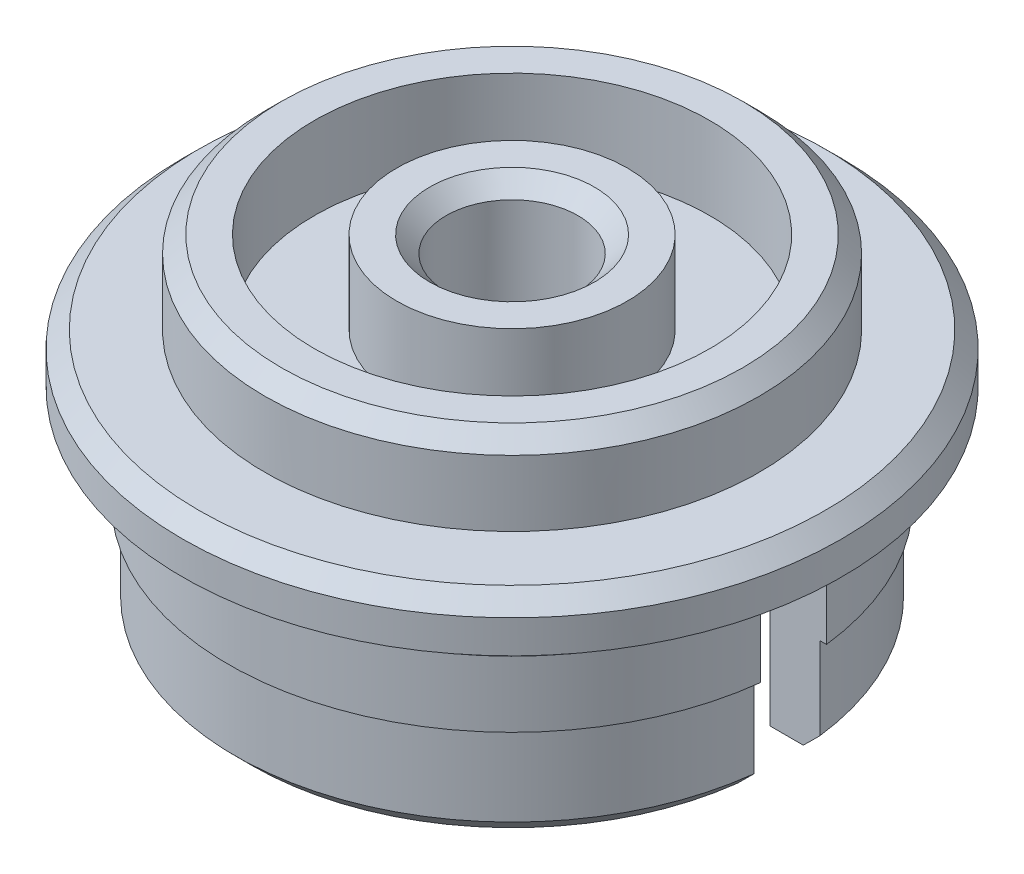
ISO-10303-21;
HEADER;
FILE_DESCRIPTION(('STEP AP214'),'2;1');
FILE_NAME('part.step','',(''),(''),'','','');
FILE_SCHEMA(('AUTOMOTIVE_DESIGN { 1 0 10303 214 1 1 1 1 }'));
ENDSEC;
DATA;
#1=APPLICATION_CONTEXT('core data for automotive mechanical design processes');
#2=APPLICATION_PROTOCOL_DEFINITION('international standard','automotive_design',2000,#1);
#3=PRODUCT_CONTEXT('',#1,'mechanical');
#4=PRODUCT('Part','Part','',(#3));
#5=PRODUCT_RELATED_PRODUCT_CATEGORY('part','',(#4));
#6=PRODUCT_DEFINITION_FORMATION('','',#4);
#7=PRODUCT_DEFINITION_CONTEXT('part definition',#1,'design');
#8=PRODUCT_DEFINITION('design','',#6,#7);
#9=PRODUCT_DEFINITION_SHAPE('','',#8);
#10=(LENGTH_UNIT() NAMED_UNIT(*) SI_UNIT(.MILLI.,.METRE.));
#11=(NAMED_UNIT(*) PLANE_ANGLE_UNIT() SI_UNIT($,.RADIAN.));
#12=(NAMED_UNIT(*) SI_UNIT($,.STERADIAN.) SOLID_ANGLE_UNIT());
#13=UNCERTAINTY_MEASURE_WITH_UNIT(LENGTH_MEASURE(1.E-05),#10,'distance_accuracy_value','');
#14=(GEOMETRIC_REPRESENTATION_CONTEXT(3) GLOBAL_UNCERTAINTY_ASSIGNED_CONTEXT((#13)) GLOBAL_UNIT_ASSIGNED_CONTEXT((#10,
#11,#12)) REPRESENTATION_CONTEXT('',''));
#15=CARTESIAN_POINT('',(0.,0.,0.));
#16=DIRECTION('',(0.,0.,1.));
#17=DIRECTION('',(1.,0.,0.));
#18=AXIS2_PLACEMENT_3D('',#15,#16,#17);
#19=CARTESIAN_POINT('',(0.,-10.,0.));
#20=DIRECTION('',(0.,-1.,0.));
#21=DIRECTION('',(0.,0.,-1.));
#22=AXIS2_PLACEMENT_3D('',#19,#20,#21);
#23=CYLINDRICAL_SURFACE('',#22,8.4);
#24=DIRECTION('',(0.,-1.,0.));
#25=VECTOR('',#24,1.);
#26=CARTESIAN_POINT('',(8.34026378479722,-10.,-1.));
#27=LINE('',#26,#25);
#28=CARTESIAN_POINT('',(8.34026378479722,-5.,-1.));
#29=VERTEX_POINT('',#28);
#30=CARTESIAN_POINT('',(8.34026378479722,-4.,-1.));
#31=VERTEX_POINT('',#30);
#32=EDGE_CURVE('E342',#29,#31,#27,.F.);
#33=ORIENTED_EDGE('',*,*,#32,.F.);
#34=CARTESIAN_POINT('',(0.,-5.,0.));
#35=DIRECTION('',(0.,-1.,0.));
#36=DIRECTION('',(0.,0.,-1.));
#37=AXIS2_PLACEMENT_3D('',#34,#35,#36);
#38=CIRCLE('',#37,8.4);
#39=CARTESIAN_POINT('',(-8.34026378479722,-5.,-1.));
#40=VERTEX_POINT('',#39);
#41=EDGE_CURVE('E223',#40,#29,#38,.T.);
#42=ORIENTED_EDGE('',*,*,#41,.F.);
#43=DIRECTION('',(0.,-1.,0.));
#44=VECTOR('',#43,1.);
#45=CARTESIAN_POINT('',(-8.34026378479722,-10.,-1.));
#46=LINE('',#45,#44);
#47=CARTESIAN_POINT('',(-8.34026378479722,-4.,-1.));
#48=VERTEX_POINT('',#47);
#49=EDGE_CURVE('E358',#48,#40,#46,.T.);
#50=ORIENTED_EDGE('',*,*,#49,.F.);
#51=CARTESIAN_POINT('',(0.,-4.,0.));
#52=DIRECTION('',(0.,-1.,0.));
#53=DIRECTION('',(0.,0.,-1.));
#54=AXIS2_PLACEMENT_3D('',#51,#52,#53);
#55=CIRCLE('',#54,8.4);
#56=EDGE_CURVE('E227',#48,#31,#55,.T.);
#57=ORIENTED_EDGE('',*,*,#56,.T.);
#58=EDGE_LOOP('',(#33,#42,#50,#57));
#59=FACE_BOUND('',#58,.T.);
#60=ADVANCED_FACE('F34',(#59),#23,.T.);
#61=CARTESIAN_POINT('',(8.4,-5.,0.));
#62=DIRECTION('',(0.,1.,0.));
#63=DIRECTION('',(0.,0.,1.));
#64=AXIS2_PLACEMENT_3D('',#61,#62,#63);
#65=PLANE('',#64);
#66=DIRECTION('',(-1.,0.,0.));
#67=VECTOR('',#66,1.);
#68=CARTESIAN_POINT('',(8.4,-5.,-1.));
#69=LINE('',#68,#67);
#70=CARTESIAN_POINT('',(8.54166260162505,-5.,-1.));
#71=VERTEX_POINT('',#70);
#72=EDGE_CURVE('E340',#71,#29,#69,.T.);
#73=ORIENTED_EDGE('',*,*,#72,.F.);
#74=CARTESIAN_POINT('',(0.,-5.,0.));
#75=DIRECTION('',(0.,-1.,0.));
#76=DIRECTION('',(0.,0.,-1.));
#77=AXIS2_PLACEMENT_3D('',#74,#75,#76);
#78=CIRCLE('',#77,8.6);
#79=CARTESIAN_POINT('',(-8.54166260162505,-5.,-1.));
#80=VERTEX_POINT('',#79);
#81=EDGE_CURVE('E219',#80,#71,#78,.T.);
#82=ORIENTED_EDGE('',*,*,#81,.F.);
#83=DIRECTION('',(-1.,0.,0.));
#84=VECTOR('',#83,1.);
#85=CARTESIAN_POINT('',(8.4,-5.,-1.));
#86=LINE('',#85,#84);
#87=EDGE_CURVE('E356',#40,#80,#86,.T.);
#88=ORIENTED_EDGE('',*,*,#87,.F.);
#89=ORIENTED_EDGE('',*,*,#41,.T.);
#90=EDGE_LOOP('',(#73,#82,#88,#89));
#91=FACE_BOUND('',#90,.T.);
#92=ADVANCED_FACE('F405',(#91),#65,.T.);
#93=CARTESIAN_POINT('',(0.,-10.,0.));
#94=DIRECTION('',(0.,-1.,0.));
#95=DIRECTION('',(0.,0.,-1.));
#96=AXIS2_PLACEMENT_3D('',#93,#94,#95);
#97=CYLINDRICAL_SURFACE('',#96,8.6);
#98=DIRECTION('',(0.,-1.,0.));
#99=VECTOR('',#98,1.);
#100=CARTESIAN_POINT('',(8.54166260162505,-10.,-1.));
#101=LINE('',#100,#99);
#102=CARTESIAN_POINT('',(8.54166260162505,-7.,-1.));
#103=VERTEX_POINT('',#102);
#104=EDGE_CURVE('E338',#103,#71,#101,.F.);
#105=ORIENTED_EDGE('',*,*,#104,.F.);
#106=CARTESIAN_POINT('',(0.,-7.,0.));
#107=DIRECTION('',(0.,-1.,0.));
#108=DIRECTION('',(0.,0.,-1.));
#109=AXIS2_PLACEMENT_3D('',#106,#107,#108);
#110=CIRCLE('',#109,8.6);
#111=CARTESIAN_POINT('',(-8.54166260162505,-7.,-1.));
#112=VERTEX_POINT('',#111);
#113=EDGE_CURVE('E215',#112,#103,#110,.T.);
#114=ORIENTED_EDGE('',*,*,#113,.F.);
#115=DIRECTION('',(0.,-1.,0.));
#116=VECTOR('',#115,1.);
#117=CARTESIAN_POINT('',(-8.54166260162505,-10.,-1.));
#118=LINE('',#117,#116);
#119=EDGE_CURVE('E354',#80,#112,#118,.T.);
#120=ORIENTED_EDGE('',*,*,#119,.F.);
#121=ORIENTED_EDGE('',*,*,#81,.T.);
#122=EDGE_LOOP('',(#105,#114,#120,#121));
#123=FACE_BOUND('',#122,.T.);
#124=ADVANCED_FACE('F412',(#123),#97,.T.);
#125=CARTESIAN_POINT('',(8.6,-7.,0.));
#126=DIRECTION('',(0.,-1.,0.));
#127=DIRECTION('',(0.,0.,-1.));
#128=AXIS2_PLACEMENT_3D('',#125,#126,#127);
#129=PLANE('',#128);
#130=DIRECTION('',(1.,0.,0.));
#131=VECTOR('',#130,1.);
#132=CARTESIAN_POINT('',(8.6,-7.,-1.));
#133=LINE('',#132,#131);
#134=CARTESIAN_POINT('',(8.34026378479722,-7.,-1.));
#135=VERTEX_POINT('',#134);
#136=EDGE_CURVE('E336',#135,#103,#133,.T.);
#137=ORIENTED_EDGE('',*,*,#136,.F.);
#138=CARTESIAN_POINT('',(0.,-7.,0.));
#139=DIRECTION('',(0.,-1.,0.));
#140=DIRECTION('',(0.,0.,-1.));
#141=AXIS2_PLACEMENT_3D('',#138,#139,#140);
#142=CIRCLE('',#141,8.4);
#143=CARTESIAN_POINT('',(-8.34026378479722,-7.,-1.));
#144=VERTEX_POINT('',#143);
#145=EDGE_CURVE('E211',#144,#135,#142,.T.);
#146=ORIENTED_EDGE('',*,*,#145,.F.);
#147=DIRECTION('',(1.,0.,0.));
#148=VECTOR('',#147,1.);
#149=CARTESIAN_POINT('',(8.6,-7.,-1.));
#150=LINE('',#149,#148);
#151=EDGE_CURVE('E309',#112,#144,#150,.T.);
#152=ORIENTED_EDGE('',*,*,#151,.F.);
#153=ORIENTED_EDGE('',*,*,#113,.T.);
#154=EDGE_LOOP('',(#137,#146,#152,#153));
#155=FACE_BOUND('',#154,.T.);
#156=ADVANCED_FACE('F537',(#155),#129,.T.);
#157=CARTESIAN_POINT('',(0.,-10.,0.));
#158=DIRECTION('',(0.,-1.,0.));
#159=DIRECTION('',(0.,0.,-1.));
#160=AXIS2_PLACEMENT_3D('',#157,#158,#159);
#161=CYLINDRICAL_SURFACE('',#160,8.4);
#162=DIRECTION('',(0.,-1.,0.));
#163=VECTOR('',#162,1.);
#164=CARTESIAN_POINT('',(8.34026378479722,-10.,-1.));
#165=LINE('',#164,#163);
#166=CARTESIAN_POINT('',(8.34026378479722,-9.50000000000001,-1.));
#167=VERTEX_POINT('',#166);
#168=EDGE_CURVE('E306',#167,#135,#165,.F.);
#169=ORIENTED_EDGE('',*,*,#168,.F.);
#170=CARTESIAN_POINT('',(0.,-9.50000000000001,0.));
#171=DIRECTION('',(0.,-1.,0.));
#172=DIRECTION('',(0.,0.,-1.));
#173=AXIS2_PLACEMENT_3D('',#170,#171,#172);
#174=CIRCLE('',#173,8.4);
#175=CARTESIAN_POINT('',(-8.34026378479722,-9.50000000000001,-1.));
#176=VERTEX_POINT('',#175);
#177=EDGE_CURVE('E264',#167,#176,#174,.F.);
#178=ORIENTED_EDGE('',*,*,#177,.T.);
#179=DIRECTION('',(0.,-1.,0.));
#180=VECTOR('',#179,1.);
#181=CARTESIAN_POINT('',(-8.34026378479722,-10.,-1.));
#182=LINE('',#181,#180);
#183=EDGE_CURVE('E304',#144,#176,#182,.T.);
#184=ORIENTED_EDGE('',*,*,#183,.F.);
#185=ORIENTED_EDGE('',*,*,#145,.T.);
#186=EDGE_LOOP('',(#169,#178,#184,#185));
#187=FACE_BOUND('',#186,.T.);
#188=ADVANCED_FACE('F303',(#187),#161,.T.);
#189=CARTESIAN_POINT('',(8.4,-10.,0.));
#190=DIRECTION('',(0.,-1.,0.));
#191=DIRECTION('',(0.,0.,-1.));
#192=AXIS2_PLACEMENT_3D('',#189,#190,#191);
#193=PLANE('',#192);
#194=DIRECTION('',(1.,0.,0.));
#195=VECTOR('',#194,1.);
#196=CARTESIAN_POINT('',(-8.94427190999916,-10.,-1.));
#197=LINE('',#196,#195);
#198=CARTESIAN_POINT('',(-7.83645327938603,-10.,-1.));
#199=VERTEX_POINT('',#198);
#200=CARTESIAN_POINT('',(-6.82715167547931,-10.,-1.));
#201=VERTEX_POINT('',#200);
#202=EDGE_CURVE('E318',#199,#201,#197,.T.);
#203=ORIENTED_EDGE('',*,*,#202,.F.);
#204=CARTESIAN_POINT('',(0.,-10.,0.));
#205=DIRECTION('',(0.,-1.,0.));
#206=DIRECTION('',(0.,0.,-1.));
#207=AXIS2_PLACEMENT_3D('',#204,#205,#206);
#208=CIRCLE('',#207,7.9);
#209=CARTESIAN_POINT('',(7.83645327938603,-10.,-1.));
#210=VERTEX_POINT('',#209);
#211=EDGE_CURVE('E255',#199,#210,#208,.T.);
#212=ORIENTED_EDGE('',*,*,#211,.T.);
#213=DIRECTION('',(1.,0.,0.));
#214=VECTOR('',#213,1.);
#215=CARTESIAN_POINT('',(5.91607978309962,-10.,-1.));
#216=LINE('',#215,#214);
#217=CARTESIAN_POINT('',(6.82715167547931,-10.,-1.));
#218=VERTEX_POINT('',#217);
#219=EDGE_CURVE('E173',#218,#210,#216,.T.);
#220=ORIENTED_EDGE('',*,*,#219,.F.);
#221=CARTESIAN_POINT('',(0.,-10.,0.));
#222=DIRECTION('',(0.,-1.,0.));
#223=DIRECTION('',(0.,0.,-1.));
#224=AXIS2_PLACEMENT_3D('',#221,#222,#223);
#225=CIRCLE('',#224,6.9);
#226=EDGE_CURVE('E187',#201,#218,#225,.T.);
#227=ORIENTED_EDGE('',*,*,#226,.F.);
#228=EDGE_LOOP('',(#203,#212,#220,#227));
#229=FACE_BOUND('',#228,.T.);
#230=ADVANCED_FACE('F316',(#229),#193,.T.);
#231=CARTESIAN_POINT('',(0.,-4.,0.));
#232=DIRECTION('',(0.,-1.,0.));
#233=DIRECTION('',(0.,0.,-1.));
#234=AXIS2_PLACEMENT_3D('',#231,#232,#233);
#235=CYLINDRICAL_SURFACE('',#234,6.9);
#236=ORIENTED_EDGE('',*,*,#226,.T.);
#237=DIRECTION('',(0.,-1.,0.));
#238=VECTOR('',#237,1.);
#239=CARTESIAN_POINT('',(6.82715167547931,-4.,-1.));
#240=LINE('',#239,#238);
#241=CARTESIAN_POINT('',(6.82715167547931,-4.,-1.));
#242=VERTEX_POINT('',#241);
#243=EDGE_CURVE('E181',#218,#242,#240,.F.);
#244=ORIENTED_EDGE('',*,*,#243,.T.);
#245=CARTESIAN_POINT('',(0.,-4.,0.));
#246=DIRECTION('',(0.,-1.,0.));
#247=DIRECTION('',(0.,0.,-1.));
#248=AXIS2_PLACEMENT_3D('',#245,#246,#247);
#249=CIRCLE('',#248,6.9);
#250=CARTESIAN_POINT('',(-6.82715167547931,-4.,-1.));
#251=VERTEX_POINT('',#250);
#252=EDGE_CURVE('E196',#251,#242,#249,.T.);
#253=ORIENTED_EDGE('',*,*,#252,.F.);
#254=DIRECTION('',(0.,-1.,0.));
#255=VECTOR('',#254,1.);
#256=CARTESIAN_POINT('',(-6.82715167547931,-4.,-1.));
#257=LINE('',#256,#255);
#258=EDGE_CURVE('E310',#251,#201,#257,.T.);
#259=ORIENTED_EDGE('',*,*,#258,.T.);
#260=EDGE_LOOP('',(#236,#244,#253,#259));
#261=FACE_BOUND('',#260,.T.);
#262=ADVANCED_FACE('F402',(#261),#235,.F.);
#263=CARTESIAN_POINT('',(0.,0.,0.));
#264=DIRECTION('',(0.,1.,0.));
#265=DIRECTION('',(0.,0.,1.));
#266=AXIS2_PLACEMENT_3D('',#263,#264,#265);
#267=PLANE('',#266);
#268=CARTESIAN_POINT('',(0.,0.,0.));
#269=DIRECTION('',(0.,1.,0.));
#270=DIRECTION('',(0.,0.,1.));
#271=AXIS2_PLACEMENT_3D('',#268,#269,#270);
#272=CIRCLE('',#271,7.);
#273=CARTESIAN_POINT('',(0.,0.,7.));
#274=VERTEX_POINT('',#273);
#275=EDGE_CURVE('E246',#274,#274,#272,.T.);
#276=ORIENTED_EDGE('',*,*,#275,.T.);
#277=EDGE_LOOP('',(#276));
#278=FACE_BOUND('',#277,.T.);
#279=CARTESIAN_POINT('',(0.,0.,0.));
#280=DIRECTION('',(0.,1.,0.));
#281=DIRECTION('',(0.,0.,1.));
#282=AXIS2_PLACEMENT_3D('',#279,#280,#281);
#283=CIRCLE('',#282,6.);
#284=CARTESIAN_POINT('',(0.,0.,6.));
#285=VERTEX_POINT('',#284);
#286=EDGE_CURVE('E201',#285,#285,#283,.T.);
#287=ORIENTED_EDGE('',*,*,#286,.F.);
#288=EDGE_LOOP('',(#287));
#289=FACE_BOUND('',#288,.T.);
#290=ADVANCED_FACE('F472',(#278,#289),#267,.T.);
#291=CARTESIAN_POINT('',(0.,-10.,0.));
#292=DIRECTION('',(0.,-1.,0.));
#293=DIRECTION('',(0.,0.,-1.));
#294=AXIS2_PLACEMENT_3D('',#291,#292,#293);
#295=CYLINDRICAL_SURFACE('',#294,7.5);
#296=CARTESIAN_POINT('',(0.,-0.500000000000002,0.));
#297=DIRECTION('',(0.,1.,0.));
#298=DIRECTION('',(0.,0.,1.));
#299=AXIS2_PLACEMENT_3D('',#296,#297,#298);
#300=CIRCLE('',#299,7.5);
#301=CARTESIAN_POINT('',(0.,-0.500000000000002,7.5));
#302=VERTEX_POINT('',#301);
#303=EDGE_CURVE('E243',#302,#302,#300,.F.);
#304=ORIENTED_EDGE('',*,*,#303,.T.);
#305=EDGE_LOOP('',(#304));
#306=FACE_BOUND('',#305,.T.);
#307=CARTESIAN_POINT('',(0.,-2.5,0.));
#308=DIRECTION('',(0.,-1.,0.));
#309=DIRECTION('',(0.,0.,-1.));
#310=AXIS2_PLACEMENT_3D('',#307,#308,#309);
#311=CIRCLE('',#310,7.5);
#312=CARTESIAN_POINT('',(0.,-2.5,-7.5));
#313=VERTEX_POINT('',#312);
#314=EDGE_CURVE('E182',#313,#313,#311,.T.);
#315=ORIENTED_EDGE('',*,*,#314,.F.);
#316=EDGE_LOOP('',(#315));
#317=FACE_BOUND('',#316,.T.);
#318=ADVANCED_FACE('F475',(#306,#317),#295,.T.);
#319=CARTESIAN_POINT('',(7.5,-2.5,0.));
#320=DIRECTION('',(0.,1.,0.));
#321=DIRECTION('',(0.,0.,1.));
#322=AXIS2_PLACEMENT_3D('',#319,#320,#321);
#323=PLANE('',#322);
#324=CARTESIAN_POINT('',(0.,-2.5,0.));
#325=DIRECTION('',(0.,1.,0.));
#326=DIRECTION('',(0.,0.,1.));
#327=AXIS2_PLACEMENT_3D('',#324,#325,#326);
#328=CIRCLE('',#327,9.5);
#329=CARTESIAN_POINT('',(0.,-2.5,9.5));
#330=VERTEX_POINT('',#329);
#331=EDGE_CURVE('E252',#330,#330,#328,.T.);
#332=ORIENTED_EDGE('',*,*,#331,.T.);
#333=EDGE_LOOP('',(#332));
#334=FACE_BOUND('',#333,.T.);
#335=ORIENTED_EDGE('',*,*,#314,.T.);
#336=EDGE_LOOP('',(#335));
#337=FACE_BOUND('',#336,.T.);
#338=ADVANCED_FACE('F479',(#334,#337),#323,.T.);
#339=CARTESIAN_POINT('',(0.,-10.,0.));
#340=DIRECTION('',(0.,-1.,0.));
#341=DIRECTION('',(0.,0.,-1.));
#342=AXIS2_PLACEMENT_3D('',#339,#340,#341);
#343=CYLINDRICAL_SURFACE('',#342,10.);
#344=CARTESIAN_POINT('',(0.,-3.,0.));
#345=DIRECTION('',(0.,1.,0.));
#346=DIRECTION('',(0.,0.,1.));
#347=AXIS2_PLACEMENT_3D('',#344,#345,#346);
#348=CIRCLE('',#347,10.);
#349=CARTESIAN_POINT('',(0.,-3.,10.));
#350=VERTEX_POINT('',#349);
#351=EDGE_CURVE('E249',#350,#350,#348,.F.);
#352=ORIENTED_EDGE('',*,*,#351,.T.);
#353=EDGE_LOOP('',(#352));
#354=FACE_BOUND('',#353,.T.);
#355=CARTESIAN_POINT('',(0.,-4.,0.));
#356=DIRECTION('',(0.,-1.,0.));
#357=DIRECTION('',(0.,0.,-1.));
#358=AXIS2_PLACEMENT_3D('',#355,#356,#357);
#359=CIRCLE('',#358,10.);
#360=CARTESIAN_POINT('',(0.,-4.,-10.));
#361=VERTEX_POINT('',#360);
#362=EDGE_CURVE('E230',#361,#361,#359,.T.);
#363=ORIENTED_EDGE('',*,*,#362,.F.);
#364=EDGE_LOOP('',(#363));
#365=FACE_BOUND('',#364,.T.);
#366=ADVANCED_FACE('F427',(#354,#365),#343,.T.);
#367=CARTESIAN_POINT('',(10.,-4.,0.));
#368=DIRECTION('',(0.,-1.,0.));
#369=DIRECTION('',(0.,0.,-1.));
#370=AXIS2_PLACEMENT_3D('',#367,#368,#369);
#371=PLANE('',#370);
#372=ORIENTED_EDGE('',*,*,#252,.T.);
#373=DIRECTION('',(1.,0.,0.));
#374=VECTOR('',#373,1.);
#375=CARTESIAN_POINT('',(5.91607978309962,-4.,-1.));
#376=LINE('',#375,#374);
#377=EDGE_CURVE('E321',#242,#31,#376,.T.);
#378=ORIENTED_EDGE('',*,*,#377,.T.);
#379=ORIENTED_EDGE('',*,*,#56,.F.);
#380=DIRECTION('',(1.,0.,0.));
#381=VECTOR('',#380,1.);
#382=CARTESIAN_POINT('',(-8.94427190999916,-4.,-1.));
#383=LINE('',#382,#381);
#384=EDGE_CURVE('E344',#48,#251,#383,.T.);
#385=ORIENTED_EDGE('',*,*,#384,.T.);
#386=EDGE_LOOP('',(#372,#378,#379,#385));
#387=FACE_BOUND('',#386,.T.);
#388=CARTESIAN_POINT('',(8.34026378479722,-4.,1.));
#389=VERTEX_POINT('',#388);
#390=CARTESIAN_POINT('',(-8.34026378479722,-4.,1.));
#391=VERTEX_POINT('',#390);
#392=EDGE_CURVE('E226',#389,#391,#55,.T.);
#393=ORIENTED_EDGE('',*,*,#392,.F.);
#394=DIRECTION('',(-1.,0.,0.));
#395=VECTOR('',#394,1.);
#396=CARTESIAN_POINT('',(5.91607978309962,-4.,1.));
#397=LINE('',#396,#395);
#398=CARTESIAN_POINT('',(6.82715167547931,-4.,1.));
#399=VERTEX_POINT('',#398);
#400=EDGE_CURVE('E319',#389,#399,#397,.T.);
#401=ORIENTED_EDGE('',*,*,#400,.T.);
#402=CARTESIAN_POINT('',(-6.82715167547931,-4.,1.));
#403=VERTEX_POINT('',#402);
#404=EDGE_CURVE('E180',#399,#403,#249,.T.);
#405=ORIENTED_EDGE('',*,*,#404,.T.);
#406=DIRECTION('',(-1.,0.,0.));
#407=VECTOR('',#406,1.);
#408=CARTESIAN_POINT('',(-8.94427190999916,-4.,1.));
#409=LINE('',#408,#407);
#410=EDGE_CURVE('E346',#403,#391,#409,.T.);
#411=ORIENTED_EDGE('',*,*,#410,.T.);
#412=EDGE_LOOP('',(#393,#401,#405,#411));
#413=FACE_BOUND('',#412,.T.);
#414=ORIENTED_EDGE('',*,*,#362,.T.);
#415=EDGE_LOOP('',(#414));
#416=FACE_BOUND('',#415,.T.);
#417=CARTESIAN_POINT('',(0.,-4.,0.));
#418=DIRECTION('',(0.,-1.,0.));
#419=DIRECTION('',(0.,0.,-1.));
#420=AXIS2_PLACEMENT_3D('',#417,#418,#419);
#421=CIRCLE('',#420,5.);
#422=CARTESIAN_POINT('',(0.,-4.,-5.));
#423=VERTEX_POINT('',#422);
#424=EDGE_CURVE('E188',#423,#423,#421,.T.);
#425=ORIENTED_EDGE('',*,*,#424,.F.);
#426=EDGE_LOOP('',(#425));
#427=FACE_BOUND('',#426,.T.);
#428=ADVANCED_FACE('F419',(#387,#413,#416,#427),#371,.T.);
#429=DIRECTION('',(0.,-1.,0.));
#430=VECTOR('',#429,1.);
#431=CARTESIAN_POINT('',(8.34026378479722,-10.,1.));
#432=LINE('',#431,#430);
#433=CARTESIAN_POINT('',(8.34026378479722,-5.,1.));
#434=VERTEX_POINT('',#433);
#435=EDGE_CURVE('E333',#389,#434,#432,.T.);
#436=ORIENTED_EDGE('',*,*,#435,.F.);
#437=ORIENTED_EDGE('',*,*,#392,.T.);
#438=DIRECTION('',(0.,-1.,0.));
#439=VECTOR('',#438,1.);
#440=CARTESIAN_POINT('',(-8.34026378479722,-10.,1.));
#441=LINE('',#440,#439);
#442=CARTESIAN_POINT('',(-8.34026378479722,-5.,1.));
#443=VERTEX_POINT('',#442);
#444=EDGE_CURVE('E373',#443,#391,#441,.F.);
#445=ORIENTED_EDGE('',*,*,#444,.F.);
#446=EDGE_CURVE('E222',#434,#443,#38,.T.);
#447=ORIENTED_EDGE('',*,*,#446,.F.);
#448=EDGE_LOOP('',(#436,#437,#445,#447));
#449=FACE_BOUND('',#448,.T.);
#450=ADVANCED_FACE('F408',(#449),#23,.T.);
#451=DIRECTION('',(1.,0.,0.));
#452=VECTOR('',#451,1.);
#453=CARTESIAN_POINT('',(8.4,-5.,1.));
#454=LINE('',#453,#452);
#455=CARTESIAN_POINT('',(8.54166260162505,-5.,1.));
#456=VERTEX_POINT('',#455);
#457=EDGE_CURVE('E331',#434,#456,#454,.T.);
#458=ORIENTED_EDGE('',*,*,#457,.F.);
#459=ORIENTED_EDGE('',*,*,#446,.T.);
#460=DIRECTION('',(1.,0.,0.));
#461=VECTOR('',#460,1.);
#462=CARTESIAN_POINT('',(8.4,-5.,1.));
#463=LINE('',#462,#461);
#464=CARTESIAN_POINT('',(-8.54166260162505,-5.,1.));
#465=VERTEX_POINT('',#464);
#466=EDGE_CURVE('E370',#465,#443,#463,.T.);
#467=ORIENTED_EDGE('',*,*,#466,.F.);
#468=EDGE_CURVE('E218',#456,#465,#78,.T.);
#469=ORIENTED_EDGE('',*,*,#468,.F.);
#470=EDGE_LOOP('',(#458,#459,#467,#469));
#471=FACE_BOUND('',#470,.T.);
#472=ADVANCED_FACE('F415',(#471),#65,.T.);
#473=DIRECTION('',(0.,-1.,0.));
#474=VECTOR('',#473,1.);
#475=CARTESIAN_POINT('',(8.54166260162505,-10.,1.));
#476=LINE('',#475,#474);
#477=CARTESIAN_POINT('',(8.54166260162505,-7.,1.));
#478=VERTEX_POINT('',#477);
#479=EDGE_CURVE('E329',#456,#478,#476,.T.);
#480=ORIENTED_EDGE('',*,*,#479,.F.);
#481=ORIENTED_EDGE('',*,*,#468,.T.);
#482=DIRECTION('',(0.,-1.,0.));
#483=VECTOR('',#482,1.);
#484=CARTESIAN_POINT('',(-8.54166260162505,-10.,1.));
#485=LINE('',#484,#483);
#486=CARTESIAN_POINT('',(-8.54166260162505,-7.,1.));
#487=VERTEX_POINT('',#486);
#488=EDGE_CURVE('E367',#487,#465,#485,.F.);
#489=ORIENTED_EDGE('',*,*,#488,.F.);
#490=EDGE_CURVE('E214',#478,#487,#110,.T.);
#491=ORIENTED_EDGE('',*,*,#490,.F.);
#492=EDGE_LOOP('',(#480,#481,#489,#491));
#493=FACE_BOUND('',#492,.T.);
#494=ADVANCED_FACE('F425',(#493),#97,.T.);
#495=DIRECTION('',(-1.,0.,0.));
#496=VECTOR('',#495,1.);
#497=CARTESIAN_POINT('',(8.6,-7.,1.));
#498=LINE('',#497,#496);
#499=CARTESIAN_POINT('',(8.34026378479722,-7.,1.));
#500=VERTEX_POINT('',#499);
#501=EDGE_CURVE('E327',#478,#500,#498,.T.);
#502=ORIENTED_EDGE('',*,*,#501,.F.);
#503=ORIENTED_EDGE('',*,*,#490,.T.);
#504=DIRECTION('',(-1.,0.,0.));
#505=VECTOR('',#504,1.);
#506=CARTESIAN_POINT('',(8.6,-7.,1.));
#507=LINE('',#506,#505);
#508=CARTESIAN_POINT('',(-8.34026378479722,-7.,1.));
#509=VERTEX_POINT('',#508);
#510=EDGE_CURVE('E364',#509,#487,#507,.T.);
#511=ORIENTED_EDGE('',*,*,#510,.F.);
#512=EDGE_CURVE('E208',#500,#509,#142,.T.);
#513=ORIENTED_EDGE('',*,*,#512,.F.);
#514=EDGE_LOOP('',(#502,#503,#511,#513));
#515=FACE_BOUND('',#514,.T.);
#516=ADVANCED_FACE('F446',(#515),#129,.T.);
#517=DIRECTION('',(0.,-1.,0.));
#518=VECTOR('',#517,1.);
#519=CARTESIAN_POINT('',(-8.34026378479722,-10.,1.));
#520=LINE('',#519,#518);
#521=CARTESIAN_POINT('',(-8.34026378479722,-9.50000000000001,1.));
#522=VERTEX_POINT('',#521);
#523=EDGE_CURVE('E362',#522,#509,#520,.F.);
#524=ORIENTED_EDGE('',*,*,#523,.F.);
#525=CARTESIAN_POINT('',(0.,-9.50000000000001,0.));
#526=DIRECTION('',(0.,-1.,0.));
#527=DIRECTION('',(0.,0.,-1.));
#528=AXIS2_PLACEMENT_3D('',#525,#526,#527);
#529=CIRCLE('',#528,8.4);
#530=CARTESIAN_POINT('',(8.34026378479722,-9.50000000000001,1.));
#531=VERTEX_POINT('',#530);
#532=EDGE_CURVE('E47',#522,#531,#529,.F.);
#533=ORIENTED_EDGE('',*,*,#532,.T.);
#534=DIRECTION('',(0.,-1.,0.));
#535=VECTOR('',#534,1.);
#536=CARTESIAN_POINT('',(8.34026378479722,-10.,1.));
#537=LINE('',#536,#535);
#538=EDGE_CURVE('E325',#500,#531,#537,.T.);
#539=ORIENTED_EDGE('',*,*,#538,.F.);
#540=ORIENTED_EDGE('',*,*,#512,.T.);
#541=EDGE_LOOP('',(#524,#533,#539,#540));
#542=FACE_BOUND('',#541,.T.);
#543=ADVANCED_FACE('F449',(#542),#161,.T.);
#544=DIRECTION('',(-1.,0.,0.));
#545=VECTOR('',#544,1.);
#546=CARTESIAN_POINT('',(5.91607978309962,-10.,1.));
#547=LINE('',#546,#545);
#548=CARTESIAN_POINT('',(7.83645327938603,-10.,1.));
#549=VERTEX_POINT('',#548);
#550=CARTESIAN_POINT('',(6.82715167547931,-10.,1.));
#551=VERTEX_POINT('',#550);
#552=EDGE_CURVE('E163',#549,#551,#547,.T.);
#553=ORIENTED_EDGE('',*,*,#552,.F.);
#554=CARTESIAN_POINT('',(0.,-10.,0.));
#555=DIRECTION('',(0.,-1.,0.));
#556=DIRECTION('',(0.,0.,-1.));
#557=AXIS2_PLACEMENT_3D('',#554,#555,#556);
#558=CIRCLE('',#557,7.9);
#559=CARTESIAN_POINT('',(-7.83645327938603,-10.,1.));
#560=VERTEX_POINT('',#559);
#561=EDGE_CURVE('E290',#549,#560,#558,.T.);
#562=ORIENTED_EDGE('',*,*,#561,.T.);
#563=DIRECTION('',(-1.,0.,0.));
#564=VECTOR('',#563,1.);
#565=CARTESIAN_POINT('',(-8.94427190999916,-10.,1.));
#566=LINE('',#565,#564);
#567=CARTESIAN_POINT('',(-6.82715167547931,-10.,1.));
#568=VERTEX_POINT('',#567);
#569=EDGE_CURVE('E186',#568,#560,#566,.T.);
#570=ORIENTED_EDGE('',*,*,#569,.F.);
#571=EDGE_CURVE('E178',#551,#568,#225,.T.);
#572=ORIENTED_EDGE('',*,*,#571,.F.);
#573=EDGE_LOOP('',(#553,#562,#570,#572));
#574=FACE_BOUND('',#573,.T.);
#575=ADVANCED_FACE('F185',(#574),#193,.T.);
#576=CARTESIAN_POINT('',(0.,-2.5,0.));
#577=DIRECTION('',(0.,1.,0.));
#578=DIRECTION('',(0.,0.,1.));
#579=AXIS2_PLACEMENT_3D('',#576,#577,#578);
#580=CYLINDRICAL_SURFACE('',#579,6.);
#581=CARTESIAN_POINT('',(0.,-2.5,0.));
#582=DIRECTION('',(0.,1.,0.));
#583=DIRECTION('',(0.,0.,1.));
#584=AXIS2_PLACEMENT_3D('',#581,#582,#583);
#585=CIRCLE('',#584,6.);
#586=CARTESIAN_POINT('',(0.,-2.5,6.));
#587=VERTEX_POINT('',#586);
#588=EDGE_CURVE('E205',#587,#587,#585,.T.);
#589=ORIENTED_EDGE('',*,*,#588,.F.);
#590=EDGE_LOOP('',(#589));
#591=FACE_BOUND('',#590,.T.);
#592=ORIENTED_EDGE('',*,*,#286,.T.);
#593=EDGE_LOOP('',(#592));
#594=FACE_BOUND('',#593,.T.);
#595=ADVANCED_FACE('F607',(#591,#594),#580,.F.);
#596=CARTESIAN_POINT('',(0.,-2.5,0.));
#597=DIRECTION('',(0.,1.,0.));
#598=DIRECTION('',(0.,0.,1.));
#599=AXIS2_PLACEMENT_3D('',#596,#597,#598);
#600=PLANE('',#599);
#601=CARTESIAN_POINT('',(0.,-2.5,0.));
#602=DIRECTION('',(0.,1.,0.));
#603=DIRECTION('',(0.,0.,1.));
#604=AXIS2_PLACEMENT_3D('',#601,#602,#603);
#605=CIRCLE('',#604,3.5);
#606=CARTESIAN_POINT('',(0.,-2.5,3.5));
#607=VERTEX_POINT('',#606);
#608=EDGE_CURVE('E198',#607,#607,#605,.T.);
#609=ORIENTED_EDGE('',*,*,#608,.F.);
#610=EDGE_LOOP('',(#609));
#611=FACE_BOUND('',#610,.T.);
#612=ORIENTED_EDGE('',*,*,#588,.T.);
#613=EDGE_LOOP('',(#612));
#614=FACE_BOUND('',#613,.T.);
#615=ADVANCED_FACE('F603',(#611,#614),#600,.T.);
#616=CARTESIAN_POINT('',(0.,-2.5,0.));
#617=DIRECTION('',(0.,1.,0.));
#618=DIRECTION('',(0.,0.,1.));
#619=AXIS2_PLACEMENT_3D('',#616,#617,#618);
#620=CYLINDRICAL_SURFACE('',#619,3.5);
#621=ORIENTED_EDGE('',*,*,#608,.T.);
#622=EDGE_LOOP('',(#621));
#623=FACE_BOUND('',#622,.T.);
#624=CARTESIAN_POINT('',(0.,0.,0.));
#625=DIRECTION('',(0.,1.,0.));
#626=DIRECTION('',(0.,0.,1.));
#627=AXIS2_PLACEMENT_3D('',#624,#625,#626);
#628=CIRCLE('',#627,3.5);
#629=CARTESIAN_POINT('',(0.,0.,3.5));
#630=VERTEX_POINT('',#629);
#631=EDGE_CURVE('E202',#630,#630,#628,.T.);
#632=ORIENTED_EDGE('',*,*,#631,.F.);
#633=EDGE_LOOP('',(#632));
#634=FACE_BOUND('',#633,.T.);
#635=ADVANCED_FACE('F600',(#623,#634),#620,.T.);
#636=CARTESIAN_POINT('',(0.,0.,0.));
#637=DIRECTION('',(0.,1.,0.));
#638=DIRECTION('',(0.,0.,1.));
#639=AXIS2_PLACEMENT_3D('',#636,#637,#638);
#640=CIRCLE('',#639,2.5);
#641=CARTESIAN_POINT('',(0.,0.,2.5));
#642=VERTEX_POINT('',#641);
#643=EDGE_CURVE('E240',#642,#642,#640,.F.);
#644=ORIENTED_EDGE('',*,*,#643,.T.);
#645=EDGE_LOOP('',(#644));
#646=FACE_BOUND('',#645,.T.);
#647=ORIENTED_EDGE('',*,*,#631,.T.);
#648=EDGE_LOOP('',(#647));
#649=FACE_BOUND('',#648,.T.);
#650=ADVANCED_FACE('F400',(#646,#649),#267,.T.);
#651=ORIENTED_EDGE('',*,*,#404,.F.);
#652=DIRECTION('',(0.,-1.,0.));
#653=VECTOR('',#652,1.);
#654=CARTESIAN_POINT('',(6.82715167547931,-4.,1.));
#655=LINE('',#654,#653);
#656=EDGE_CURVE('E166',#399,#551,#655,.T.);
#657=ORIENTED_EDGE('',*,*,#656,.T.);
#658=ORIENTED_EDGE('',*,*,#571,.T.);
#659=DIRECTION('',(0.,-1.,0.));
#660=VECTOR('',#659,1.);
#661=CARTESIAN_POINT('',(-6.82715167547931,-4.,1.));
#662=LINE('',#661,#660);
#663=EDGE_CURVE('E360',#568,#403,#662,.F.);
#664=ORIENTED_EDGE('',*,*,#663,.T.);
#665=EDGE_LOOP('',(#651,#657,#658,#664));
#666=FACE_BOUND('',#665,.T.);
#667=ADVANCED_FACE('F176',(#666),#235,.F.);
#668=CARTESIAN_POINT('',(0.,-4.,0.));
#669=DIRECTION('',(0.,-1.,0.));
#670=DIRECTION('',(0.,0.,-1.));
#671=AXIS2_PLACEMENT_3D('',#668,#669,#670);
#672=CYLINDRICAL_SURFACE('',#671,5.);
#673=ORIENTED_EDGE('',*,*,#424,.T.);
#674=EDGE_LOOP('',(#673));
#675=FACE_BOUND('',#674,.T.);
#676=CARTESIAN_POINT('',(0.,-10.,0.));
#677=DIRECTION('',(0.,-1.,0.));
#678=DIRECTION('',(0.,0.,-1.));
#679=AXIS2_PLACEMENT_3D('',#676,#677,#678);
#680=CIRCLE('',#679,5.);
#681=CARTESIAN_POINT('',(0.,-10.,-5.));
#682=VERTEX_POINT('',#681);
#683=EDGE_CURVE('E192',#682,#682,#680,.T.);
#684=ORIENTED_EDGE('',*,*,#683,.F.);
#685=EDGE_LOOP('',(#684));
#686=FACE_BOUND('',#685,.T.);
#687=ADVANCED_FACE('F389',(#675,#686),#672,.T.);
#688=CARTESIAN_POINT('',(0.,-10.,0.));
#689=DIRECTION('',(0.,-1.,0.));
#690=DIRECTION('',(0.,0.,-1.));
#691=AXIS2_PLACEMENT_3D('',#688,#689,#690);
#692=CIRCLE('',#691,3.5);
#693=CARTESIAN_POINT('',(0.,-10.,-3.5));
#694=VERTEX_POINT('',#693);
#695=EDGE_CURVE('E379',#694,#694,#692,.T.);
#696=ORIENTED_EDGE('',*,*,#695,.F.);
#697=EDGE_LOOP('',(#696));
#698=FACE_BOUND('',#697,.T.);
#699=ORIENTED_EDGE('',*,*,#683,.T.);
#700=EDGE_LOOP('',(#699));
#701=FACE_BOUND('',#700,.T.);
#702=ADVANCED_FACE('F387',(#698,#701),#193,.T.);
#703=CARTESIAN_POINT('',(0.,-4.,0.));
#704=DIRECTION('',(0.,-1.,0.));
#705=DIRECTION('',(0.,0.,-1.));
#706=AXIS2_PLACEMENT_3D('',#703,#704,#705);
#707=CYLINDRICAL_SURFACE('',#706,3.5);
#708=CARTESIAN_POINT('',(0.,-4.,0.));
#709=DIRECTION('',(0.,-1.,0.));
#710=DIRECTION('',(0.,0.,-1.));
#711=AXIS2_PLACEMENT_3D('',#708,#709,#710);
#712=CIRCLE('',#711,3.5);
#713=CARTESIAN_POINT('',(0.,-4.,-3.5));
#714=VERTEX_POINT('',#713);
#715=EDGE_CURVE('E380',#714,#714,#712,.T.);
#716=ORIENTED_EDGE('',*,*,#715,.F.);
#717=EDGE_LOOP('',(#716));
#718=FACE_BOUND('',#717,.T.);
#719=ORIENTED_EDGE('',*,*,#695,.T.);
#720=EDGE_LOOP('',(#719));
#721=FACE_BOUND('',#720,.T.);
#722=ADVANCED_FACE('F397',(#718,#721),#707,.F.);
#723=CARTESIAN_POINT('',(0.,-4.,0.));
#724=DIRECTION('',(0.,-1.,0.));
#725=DIRECTION('',(0.,0.,-1.));
#726=AXIS2_PLACEMENT_3D('',#723,#724,#725);
#727=PLANE('',#726);
#728=CARTESIAN_POINT('',(0.,-4.,0.));
#729=DIRECTION('',(0.,-1.,0.));
#730=DIRECTION('',(0.,0.,-1.));
#731=AXIS2_PLACEMENT_3D('',#728,#729,#730);
#732=CIRCLE('',#731,2.);
#733=CARTESIAN_POINT('',(0.,-4.,-2.));
#734=VERTEX_POINT('',#733);
#735=EDGE_CURVE('E376',#734,#734,#732,.F.);
#736=ORIENTED_EDGE('',*,*,#735,.T.);
#737=EDGE_LOOP('',(#736));
#738=FACE_BOUND('',#737,.T.);
#739=ORIENTED_EDGE('',*,*,#715,.T.);
#740=EDGE_LOOP('',(#739));
#741=FACE_BOUND('',#740,.T.);
#742=ADVANCED_FACE('F640',(#738,#741),#727,.T.);
#743=CARTESIAN_POINT('',(0.,-10.001,0.));
#744=DIRECTION('',(0.,1.,0.));
#745=DIRECTION('',(0.,0.,1.));
#746=AXIS2_PLACEMENT_3D('',#743,#744,#745);
#747=CYLINDRICAL_SURFACE('',#746,2.);
#748=CARTESIAN_POINT('',(0.,-0.499999999999995,0.));
#749=DIRECTION('',(0.,1.,0.));
#750=DIRECTION('',(0.,0.,1.));
#751=AXIS2_PLACEMENT_3D('',#748,#749,#750);
#752=CIRCLE('',#751,2.);
#753=CARTESIAN_POINT('',(0.,-0.499999999999995,2.));
#754=VERTEX_POINT('',#753);
#755=EDGE_CURVE('E237',#754,#754,#752,.T.);
#756=ORIENTED_EDGE('',*,*,#755,.T.);
#757=EDGE_LOOP('',(#756));
#758=FACE_BOUND('',#757,.T.);
#759=ORIENTED_EDGE('',*,*,#735,.F.);
#760=EDGE_LOOP('',(#759));
#761=FACE_BOUND('',#760,.T.);
#762=ADVANCED_FACE('F282',(#758,#761),#747,.F.);
#763=CARTESIAN_POINT('',(-8.94427190999916,-4.,1.));
#764=DIRECTION('',(0.,0.,1.));
#765=DIRECTION('',(1.,0.,0.));
#766=AXIS2_PLACEMENT_3D('',#763,#764,#765);
#767=PLANE('',#766);
#768=ORIENTED_EDGE('',*,*,#569,.T.);
#769=CARTESIAN_POINT('',(-7.83645327938603,-10.,1.));
#770=CARTESIAN_POINT('',(-7.92044125177138,-9.91668637044004,1.));
#771=CARTESIAN_POINT('',(-8.00441944676604,-9.83336288897579,1.));
#772=CARTESIAN_POINT('',(-8.17235628190309,-9.66669622230911,1.));
#773=CARTESIAN_POINT('',(-8.25631492204549,-9.58335303710669,1.));
#774=CARTESIAN_POINT('',(-8.34026378479722,-9.50000000000001,1.));
#775=B_SPLINE_CURVE_WITH_KNOTS('',3,(#769,#770,#771,#772,#773,#774),.UNSPECIFIED.,.F.,.F.,(4,2,
4),(0.,0.354903167330133,0.709806334360533),.UNSPECIFIED.);
#776=EDGE_CURVE('E61',#560,#522,#775,.T.);
#777=ORIENTED_EDGE('',*,*,#776,.T.);
#778=ORIENTED_EDGE('',*,*,#523,.T.);
#779=ORIENTED_EDGE('',*,*,#510,.T.);
#780=ORIENTED_EDGE('',*,*,#488,.T.);
#781=ORIENTED_EDGE('',*,*,#466,.T.);
#782=ORIENTED_EDGE('',*,*,#444,.T.);
#783=ORIENTED_EDGE('',*,*,#410,.F.);
#784=ORIENTED_EDGE('',*,*,#663,.F.);
#785=EDGE_LOOP('',(#768,#777,#778,#779,#780,#781,#782,#783,#784));
#786=FACE_BOUND('',#785,.T.);
#787=ADVANCED_FACE('F278',(#786),#767,.F.);
#788=CARTESIAN_POINT('',(-8.94427190999916,-4.,-1.));
#789=DIRECTION('',(0.,0.,-1.));
#790=DIRECTION('',(-1.,0.,0.));
#791=AXIS2_PLACEMENT_3D('',#788,#789,#790);
#792=PLANE('',#791);
#793=ORIENTED_EDGE('',*,*,#183,.T.);
#794=CARTESIAN_POINT('',(-8.34026378479722,-9.50000000000001,-1.));
#795=CARTESIAN_POINT('',(-8.25631492204549,-9.58335303710669,-1.));
#796=CARTESIAN_POINT('',(-8.17235628190309,-9.66669622230911,-1.));
#797=CARTESIAN_POINT('',(-8.00441944676604,-9.83336288897579,-1.));
#798=CARTESIAN_POINT('',(-7.92044125177138,-9.91668637044004,-1.));
#799=CARTESIAN_POINT('',(-7.83645327938603,-10.,-1.));
#800=B_SPLINE_CURVE_WITH_KNOTS('',3,(#794,#795,#796,#797,#798,#799),.UNSPECIFIED.,.F.,.F.,(4,2,
4),(0.,0.3549031670304,0.709806334360533),.UNSPECIFIED.);
#801=EDGE_CURVE('E291',#176,#199,#800,.T.);
#802=ORIENTED_EDGE('',*,*,#801,.T.);
#803=ORIENTED_EDGE('',*,*,#202,.T.);
#804=ORIENTED_EDGE('',*,*,#258,.F.);
#805=ORIENTED_EDGE('',*,*,#384,.F.);
#806=ORIENTED_EDGE('',*,*,#49,.T.);
#807=ORIENTED_EDGE('',*,*,#87,.T.);
#808=ORIENTED_EDGE('',*,*,#119,.T.);
#809=ORIENTED_EDGE('',*,*,#151,.T.);
#810=EDGE_LOOP('',(#793,#802,#803,#804,#805,#806,#807,#808,#809));
#811=FACE_BOUND('',#810,.T.);
#812=ADVANCED_FACE('F272',(#811),#792,.F.);
#813=CARTESIAN_POINT('',(5.91607978309962,-4.,-1.));
#814=DIRECTION('',(0.,0.,-1.));
#815=DIRECTION('',(-1.,0.,0.));
#816=AXIS2_PLACEMENT_3D('',#813,#814,#815);
#817=PLANE('',#816);
#818=ORIENTED_EDGE('',*,*,#219,.T.);
#819=CARTESIAN_POINT('',(7.83645327938603,-10.,-1.));
#820=CARTESIAN_POINT('',(7.92044125177138,-9.91668637044004,-1.));
#821=CARTESIAN_POINT('',(8.00441944676604,-9.83336288897579,-1.));
#822=CARTESIAN_POINT('',(8.17235628190309,-9.66669622230911,-1.));
#823=CARTESIAN_POINT('',(8.25631492204549,-9.58335303710669,-1.));
#824=CARTESIAN_POINT('',(8.34026378479722,-9.50000000000001,-1.));
#825=B_SPLINE_CURVE_WITH_KNOTS('',3,(#819,#820,#821,#822,#823,#824),.UNSPECIFIED.,.F.,.F.,(4,2,
4),(0.,0.354903167330133,0.709806334360533),.UNSPECIFIED.);
#826=EDGE_CURVE('E258',#210,#167,#825,.T.);
#827=ORIENTED_EDGE('',*,*,#826,.T.);
#828=ORIENTED_EDGE('',*,*,#168,.T.);
#829=ORIENTED_EDGE('',*,*,#136,.T.);
#830=ORIENTED_EDGE('',*,*,#104,.T.);
#831=ORIENTED_EDGE('',*,*,#72,.T.);
#832=ORIENTED_EDGE('',*,*,#32,.T.);
#833=ORIENTED_EDGE('',*,*,#377,.F.);
#834=ORIENTED_EDGE('',*,*,#243,.F.);
#835=EDGE_LOOP('',(#818,#827,#828,#829,#830,#831,#832,#833,#834));
#836=FACE_BOUND('',#835,.T.);
#837=ADVANCED_FACE('F269',(#836),#817,.F.);
#838=CARTESIAN_POINT('',(5.91607978309962,-4.,1.));
#839=DIRECTION('',(0.,0.,1.));
#840=DIRECTION('',(1.,0.,0.));
#841=AXIS2_PLACEMENT_3D('',#838,#839,#840);
#842=PLANE('',#841);
#843=ORIENTED_EDGE('',*,*,#538,.T.);
#844=CARTESIAN_POINT('',(8.34026378479722,-9.50000000000001,1.));
#845=CARTESIAN_POINT('',(8.25631492204549,-9.58335303710669,1.));
#846=CARTESIAN_POINT('',(8.17235628190309,-9.66669622230911,1.));
#847=CARTESIAN_POINT('',(8.00441944676604,-9.83336288897579,1.));
#848=CARTESIAN_POINT('',(7.92044125177138,-9.91668637044004,1.));
#849=CARTESIAN_POINT('',(7.83645327938603,-10.,1.));
#850=B_SPLINE_CURVE_WITH_KNOTS('',3,(#844,#845,#846,#847,#848,#849),.UNSPECIFIED.,.F.,.F.,(4,2,
4),(0.,0.3549031670304,0.709806334360533),.UNSPECIFIED.);
#851=EDGE_CURVE('E11',#531,#549,#850,.T.);
#852=ORIENTED_EDGE('',*,*,#851,.T.);
#853=ORIENTED_EDGE('',*,*,#552,.T.);
#854=ORIENTED_EDGE('',*,*,#656,.F.);
#855=ORIENTED_EDGE('',*,*,#400,.F.);
#856=ORIENTED_EDGE('',*,*,#435,.T.);
#857=ORIENTED_EDGE('',*,*,#457,.T.);
#858=ORIENTED_EDGE('',*,*,#479,.T.);
#859=ORIENTED_EDGE('',*,*,#501,.T.);
#860=EDGE_LOOP('',(#843,#852,#853,#854,#855,#856,#857,#858,#859));
#861=FACE_BOUND('',#860,.T.);
#862=ADVANCED_FACE('F165',(#861),#842,.F.);
#863=CARTESIAN_POINT('',(0.,-0.499999999999995,0.));
#864=DIRECTION('',(0.,1.,0.));
#865=DIRECTION('',(0.,0.,1.));
#866=AXIS2_PLACEMENT_3D('',#863,#864,#865);
#867=CONICAL_SURFACE('',#866,2.,0.785398163397452);
#868=ORIENTED_EDGE('',*,*,#643,.F.);
#869=EDGE_LOOP('',(#868));
#870=FACE_BOUND('',#869,.T.);
#871=ORIENTED_EDGE('',*,*,#755,.F.);
#872=EDGE_LOOP('',(#871));
#873=FACE_BOUND('',#872,.T.);
#874=ADVANCED_FACE('F277',(#870,#873),#867,.F.);
#875=CARTESIAN_POINT('',(0.,-0.500000000000002,0.));
#876=DIRECTION('',(0.,-1.,0.));
#877=DIRECTION('',(0.,0.,-1.));
#878=AXIS2_PLACEMENT_3D('',#875,#876,#877);
#879=CONICAL_SURFACE('',#878,7.5,0.785398163397449);
#880=ORIENTED_EDGE('',*,*,#275,.F.);
#881=EDGE_LOOP('',(#880));
#882=FACE_BOUND('',#881,.T.);
#883=ORIENTED_EDGE('',*,*,#303,.F.);
#884=EDGE_LOOP('',(#883));
#885=FACE_BOUND('',#884,.T.);
#886=ADVANCED_FACE('F459',(#882,#885),#879,.T.);
#887=CARTESIAN_POINT('',(0.,-3.,0.));
#888=DIRECTION('',(0.,-1.,0.));
#889=DIRECTION('',(0.,0.,-1.));
#890=AXIS2_PLACEMENT_3D('',#887,#888,#889);
#891=CONICAL_SURFACE('',#890,10.,0.785398163397452);
#892=ORIENTED_EDGE('',*,*,#331,.F.);
#893=EDGE_LOOP('',(#892));
#894=FACE_BOUND('',#893,.T.);
#895=ORIENTED_EDGE('',*,*,#351,.F.);
#896=EDGE_LOOP('',(#895));
#897=FACE_BOUND('',#896,.T.);
#898=ADVANCED_FACE('F455',(#894,#897),#891,.T.);
#899=CARTESIAN_POINT('',(0.,-10.,0.));
#900=DIRECTION('',(0.,1.,0.));
#901=DIRECTION('',(0.,0.,1.));
#902=AXIS2_PLACEMENT_3D('',#899,#900,#901);
#903=CONICAL_SURFACE('',#902,7.9,0.785398163397452);
#904=ORIENTED_EDGE('',*,*,#801,.F.);
#905=ORIENTED_EDGE('',*,*,#177,.F.);
#906=ORIENTED_EDGE('',*,*,#826,.F.);
#907=ORIENTED_EDGE('',*,*,#211,.F.);
#908=EDGE_LOOP('',(#904,#905,#906,#907));
#909=FACE_BOUND('',#908,.T.);
#910=ADVANCED_FACE('F266',(#909),#903,.T.);
#911=CARTESIAN_POINT('',(0.,-10.,0.));
#912=DIRECTION('',(0.,1.,0.));
#913=DIRECTION('',(0.,0.,1.));
#914=AXIS2_PLACEMENT_3D('',#911,#912,#913);
#915=CONICAL_SURFACE('',#914,7.9,0.785398163397452);
#916=ORIENTED_EDGE('',*,*,#851,.F.);
#917=ORIENTED_EDGE('',*,*,#532,.F.);
#918=ORIENTED_EDGE('',*,*,#776,.F.);
#919=ORIENTED_EDGE('',*,*,#561,.F.);
#920=EDGE_LOOP('',(#916,#917,#918,#919));
#921=FACE_BOUND('',#920,.T.);
#922=ADVANCED_FACE('F36',(#921),#915,.T.);
#923=CLOSED_SHELL('',(#60,#92,#124,#156,#188,#230,#262,#290,#318,#338,#366,#428,#450,#472,#494,
#516,#543,#575,#595,#615,#635,#650,#667,#687,#702,#722,#742,#762,#787,#812,#837,#862,#874,#886,
#898,#910,#922));
#924=MANIFOLD_SOLID_BREP('B2',#923);
#925=ADVANCED_BREP_SHAPE_REPRESENTATION('',(#18,#924),#14);
#926=SHAPE_DEFINITION_REPRESENTATION(#9,#925);
ENDSEC;
END-ISO-10303-21;
